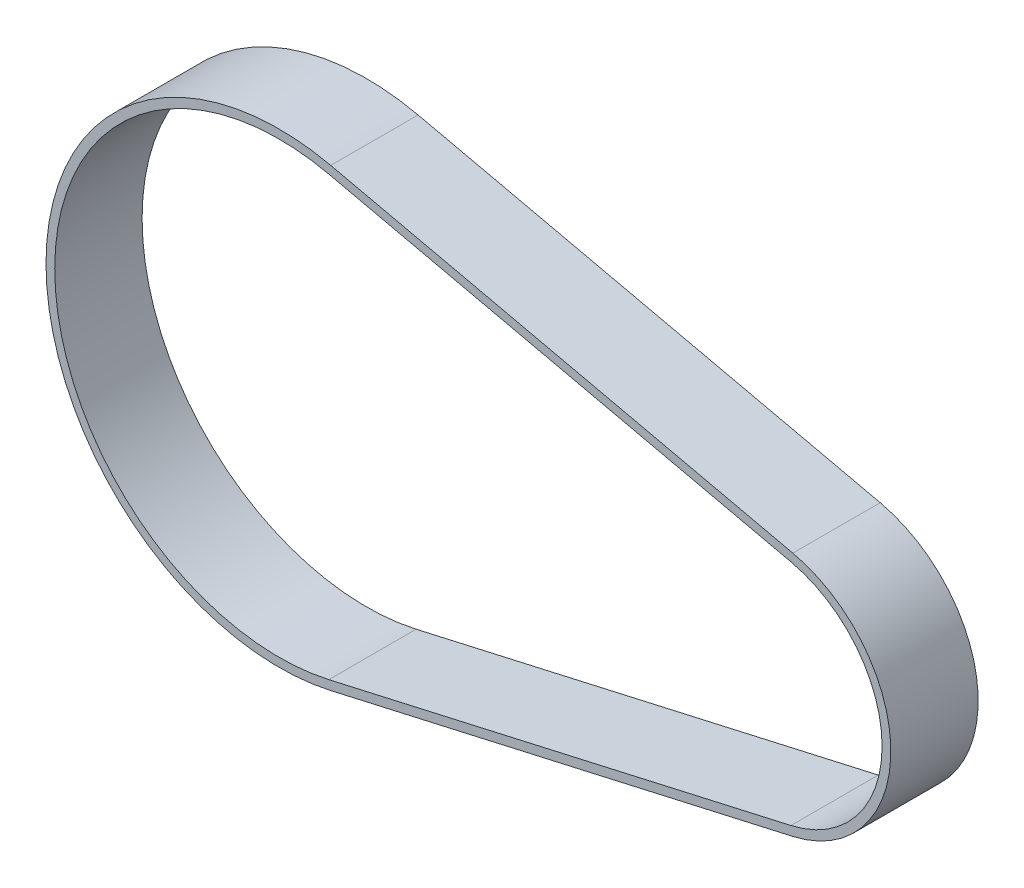
ISO-10303-21;
HEADER;
FILE_DESCRIPTION(('STEP AP214'),'2;1');
FILE_NAME('part.step','',(''),(''),'','','');
FILE_SCHEMA(('AUTOMOTIVE_DESIGN { 1 0 10303 214 1 1 1 1 }'));
ENDSEC;
DATA;
#1=APPLICATION_CONTEXT('core data for automotive mechanical design processes');
#2=APPLICATION_PROTOCOL_DEFINITION('international standard','automotive_design',2000,#1);
#3=PRODUCT_CONTEXT('',#1,'mechanical');
#4=PRODUCT('Part','Part','',(#3));
#5=PRODUCT_RELATED_PRODUCT_CATEGORY('part','',(#4));
#6=PRODUCT_DEFINITION_FORMATION('','',#4);
#7=PRODUCT_DEFINITION_CONTEXT('part definition',#1,'design');
#8=PRODUCT_DEFINITION('design','',#6,#7);
#9=PRODUCT_DEFINITION_SHAPE('','',#8);
#10=(LENGTH_UNIT() NAMED_UNIT(*) SI_UNIT(.MILLI.,.METRE.));
#11=(NAMED_UNIT(*) PLANE_ANGLE_UNIT() SI_UNIT($,.RADIAN.));
#12=(NAMED_UNIT(*) SI_UNIT($,.STERADIAN.) SOLID_ANGLE_UNIT());
#13=UNCERTAINTY_MEASURE_WITH_UNIT(LENGTH_MEASURE(1.E-05),#10,'distance_accuracy_value','');
#14=(GEOMETRIC_REPRESENTATION_CONTEXT(3) GLOBAL_UNCERTAINTY_ASSIGNED_CONTEXT((#13)) GLOBAL_UNIT_ASSIGNED_CONTEXT((#10,
#11,#12)) REPRESENTATION_CONTEXT('',''));
#15=CARTESIAN_POINT('',(0.,0.,0.));
#16=DIRECTION('',(0.,0.,1.));
#17=DIRECTION('',(1.,0.,0.));
#18=AXIS2_PLACEMENT_3D('',#15,#16,#17);
#19=CARTESIAN_POINT('',(0.,0.,10.));
#20=DIRECTION('',(0.,0.,-1.));
#21=DIRECTION('',(-1.,0.,0.));
#22=AXIS2_PLACEMENT_3D('',#19,#20,#21);
#23=PLANE('',#22);
#24=CARTESIAN_POINT('',(0.,0.,10.));
#25=DIRECTION('',(0.,0.,1.));
#26=DIRECTION('',(-1.,0.,0.));
#27=AXIS2_PLACEMENT_3D('',#24,#25,#26);
#28=CIRCLE('',#27,26.6930054672571);
#29=CARTESIAN_POINT('',(5.90067497626424,26.0326444238672,10.));
#30=VERTEX_POINT('',#29);
#31=CARTESIAN_POINT('',(5.90067497626424,-26.0326444238672,10.));
#32=VERTEX_POINT('',#31);
#33=EDGE_CURVE('E118',#30,#32,#28,.T.);
#34=ORIENTED_EDGE('',*,*,#33,.T.);
#35=DIRECTION('',(0.975260895810332,0.221056972527964,0.));
#36=VECTOR('',#35,1.);
#37=CARTESIAN_POINT('',(58.7992391930494,-14.0424205698465,10.));
#38=LINE('',#37,#36);
#39=CARTESIAN_POINT('',(58.7992391930494,-14.0424205698465,10.));
#40=VERTEX_POINT('',#39);
#41=EDGE_CURVE('E121',#32,#40,#38,.T.);
#42=ORIENTED_EDGE('',*,*,#41,.T.);
#43=CARTESIAN_POINT('',(55.6163216871081,0.,10.));
#44=DIRECTION('',(0.,0.,1.));
#45=DIRECTION('',(-1.,0.,0.));
#46=AXIS2_PLACEMENT_3D('',#43,#44,#45);
#47=CIRCLE('',#46,14.3986297719636);
#48=CARTESIAN_POINT('',(58.7992391930494,14.0424205698465,10.));
#49=VERTEX_POINT('',#48);
#50=EDGE_CURVE('E124',#40,#49,#47,.T.);
#51=ORIENTED_EDGE('',*,*,#50,.T.);
#52=DIRECTION('',(-0.975260895810332,0.221056972527964,0.));
#53=VECTOR('',#52,1.);
#54=CARTESIAN_POINT('',(5.90067497626424,26.0326444238672,10.));
#55=LINE('',#54,#53);
#56=EDGE_CURVE('E126',#49,#30,#55,.T.);
#57=ORIENTED_EDGE('',*,*,#56,.T.);
#58=EDGE_LOOP('',(#34,#42,#51,#57));
#59=FACE_BOUND('',#58,.T.);
#60=CARTESIAN_POINT('',(0.,0.,10.));
#61=DIRECTION('',(0.,0.,1.));
#62=DIRECTION('',(-1.,0.,0.));
#63=AXIS2_PLACEMENT_3D('',#60,#61,#62);
#64=CIRCLE('',#63,25.6930054672571);
#65=CARTESIAN_POINT('',(5.67961800373628,25.0573835280568,10.));
#66=VERTEX_POINT('',#65);
#67=CARTESIAN_POINT('',(5.67961800373628,-25.0573835280568,10.));
#68=VERTEX_POINT('',#67);
#69=EDGE_CURVE('E82',#66,#68,#64,.T.);
#70=ORIENTED_EDGE('',*,*,#69,.F.);
#71=DIRECTION('',(-0.975260895810332,0.221056972527964,0.));
#72=VECTOR('',#71,1.);
#73=CARTESIAN_POINT('',(5.67961800373628,25.0573835280568,10.));
#74=LINE('',#73,#72);
#75=CARTESIAN_POINT('',(58.5781822205214,13.0671596740362,10.));
#76=VERTEX_POINT('',#75);
#77=EDGE_CURVE('E104',#76,#66,#74,.T.);
#78=ORIENTED_EDGE('',*,*,#77,.F.);
#79=CARTESIAN_POINT('',(55.6163216871081,0.,10.));
#80=DIRECTION('',(0.,0.,1.));
#81=DIRECTION('',(-1.,0.,0.));
#82=AXIS2_PLACEMENT_3D('',#79,#80,#81);
#83=CIRCLE('',#82,13.3986297719636);
#84=CARTESIAN_POINT('',(58.5781822205214,-13.0671596740362,10.));
#85=VERTEX_POINT('',#84);
#86=EDGE_CURVE('E102',#85,#76,#83,.T.);
#87=ORIENTED_EDGE('',*,*,#86,.F.);
#88=DIRECTION('',(0.975260895810332,0.221056972527964,0.));
#89=VECTOR('',#88,1.);
#90=CARTESIAN_POINT('',(58.5781822205214,-13.0671596740362,10.));
#91=LINE('',#90,#89);
#92=EDGE_CURVE('E90',#68,#85,#91,.T.);
#93=ORIENTED_EDGE('',*,*,#92,.F.);
#94=EDGE_LOOP('',(#70,#78,#87,#93));
#95=FACE_BOUND('',#94,.T.);
#96=ADVANCED_FACE('F17',(#59,#95),#23,.F.);
#97=CARTESIAN_POINT('',(0.,0.,0.));
#98=DIRECTION('',(0.,0.,-1.));
#99=DIRECTION('',(-1.,0.,0.));
#100=AXIS2_PLACEMENT_3D('',#97,#98,#99);
#101=PLANE('',#100);
#102=CARTESIAN_POINT('',(0.,0.,0.));
#103=DIRECTION('',(0.,0.,1.));
#104=DIRECTION('',(-1.,0.,0.));
#105=AXIS2_PLACEMENT_3D('',#102,#103,#104);
#106=CIRCLE('',#105,26.6930054672571);
#107=CARTESIAN_POINT('',(5.90067497626424,26.0326444238672,0.));
#108=VERTEX_POINT('',#107);
#109=CARTESIAN_POINT('',(5.90067497626424,-26.0326444238672,0.));
#110=VERTEX_POINT('',#109);
#111=EDGE_CURVE('E98',#108,#110,#106,.T.);
#112=ORIENTED_EDGE('',*,*,#111,.F.);
#113=DIRECTION('',(-0.975260895810332,0.221056972527964,0.));
#114=VECTOR('',#113,1.);
#115=CARTESIAN_POINT('',(5.90067497626424,26.0326444238672,0.));
#116=LINE('',#115,#114);
#117=CARTESIAN_POINT('',(58.7992391930494,14.0424205698465,0.));
#118=VERTEX_POINT('',#117);
#119=EDGE_CURVE('E122',#118,#108,#116,.T.);
#120=ORIENTED_EDGE('',*,*,#119,.F.);
#121=CARTESIAN_POINT('',(55.6163216871081,0.,0.));
#122=DIRECTION('',(0.,0.,1.));
#123=DIRECTION('',(-1.,0.,0.));
#124=AXIS2_PLACEMENT_3D('',#121,#122,#123);
#125=CIRCLE('',#124,14.3986297719636);
#126=CARTESIAN_POINT('',(58.7992391930494,-14.0424205698465,0.));
#127=VERTEX_POINT('',#126);
#128=EDGE_CURVE('E133',#127,#118,#125,.T.);
#129=ORIENTED_EDGE('',*,*,#128,.F.);
#130=DIRECTION('',(0.975260895810332,0.221056972527964,0.));
#131=VECTOR('',#130,1.);
#132=CARTESIAN_POINT('',(58.7992391930494,-14.0424205698465,0.));
#133=LINE('',#132,#131);
#134=EDGE_CURVE('E131',#110,#127,#133,.T.);
#135=ORIENTED_EDGE('',*,*,#134,.F.);
#136=EDGE_LOOP('',(#112,#120,#129,#135));
#137=FACE_BOUND('',#136,.T.);
#138=DIRECTION('',(-0.975260895810332,0.221056972527964,0.));
#139=VECTOR('',#138,1.);
#140=CARTESIAN_POINT('',(5.67961800373628,25.0573835280568,0.));
#141=LINE('',#140,#139);
#142=CARTESIAN_POINT('',(58.5781822205214,13.0671596740362,0.));
#143=VERTEX_POINT('',#142);
#144=CARTESIAN_POINT('',(5.67961800373628,25.0573835280568,0.));
#145=VERTEX_POINT('',#144);
#146=EDGE_CURVE('E91',#143,#145,#141,.T.);
#147=ORIENTED_EDGE('',*,*,#146,.T.);
#148=CARTESIAN_POINT('',(0.,0.,0.));
#149=DIRECTION('',(0.,0.,1.));
#150=DIRECTION('',(-1.,0.,0.));
#151=AXIS2_PLACEMENT_3D('',#148,#149,#150);
#152=CIRCLE('',#151,25.6930054672571);
#153=CARTESIAN_POINT('',(5.67961800373628,-25.0573835280568,0.));
#154=VERTEX_POINT('',#153);
#155=EDGE_CURVE('E40',#145,#154,#152,.T.);
#156=ORIENTED_EDGE('',*,*,#155,.T.);
#157=DIRECTION('',(0.975260895810332,0.221056972527964,0.));
#158=VECTOR('',#157,1.);
#159=CARTESIAN_POINT('',(58.5781822205214,-13.0671596740362,0.));
#160=LINE('',#159,#158);
#161=CARTESIAN_POINT('',(58.5781822205214,-13.0671596740362,0.));
#162=VERTEX_POINT('',#161);
#163=EDGE_CURVE('E97',#154,#162,#160,.T.);
#164=ORIENTED_EDGE('',*,*,#163,.T.);
#165=CARTESIAN_POINT('',(55.6163216871081,0.,0.));
#166=DIRECTION('',(0.,0.,1.));
#167=DIRECTION('',(-1.,0.,0.));
#168=AXIS2_PLACEMENT_3D('',#165,#166,#167);
#169=CIRCLE('',#168,13.3986297719636);
#170=EDGE_CURVE('E110',#162,#143,#169,.T.);
#171=ORIENTED_EDGE('',*,*,#170,.T.);
#172=EDGE_LOOP('',(#147,#156,#164,#171));
#173=FACE_BOUND('',#172,.T.);
#174=ADVANCED_FACE('F151',(#137,#173),#101,.T.);
#175=CARTESIAN_POINT('',(0.,0.,10.));
#176=DIRECTION('',(0.,0.,-1.));
#177=DIRECTION('',(-1.,0.,0.));
#178=AXIS2_PLACEMENT_3D('',#175,#176,#177);
#179=CYLINDRICAL_SURFACE('',#178,26.6930054672571);
#180=ORIENTED_EDGE('',*,*,#111,.T.);
#181=DIRECTION('',(0.,0.,-1.));
#182=VECTOR('',#181,1.);
#183=CARTESIAN_POINT('',(5.90067497626424,-26.0326444238672,10.));
#184=LINE('',#183,#182);
#185=EDGE_CURVE('E11',#32,#110,#184,.T.);
#186=ORIENTED_EDGE('',*,*,#185,.F.);
#187=ORIENTED_EDGE('',*,*,#33,.F.);
#188=DIRECTION('',(0.,0.,-1.));
#189=VECTOR('',#188,1.);
#190=CARTESIAN_POINT('',(5.90067497626424,26.0326444238672,10.));
#191=LINE('',#190,#189);
#192=EDGE_CURVE('E128',#30,#108,#191,.T.);
#193=ORIENTED_EDGE('',*,*,#192,.T.);
#194=EDGE_LOOP('',(#180,#186,#187,#193));
#195=FACE_BOUND('',#194,.T.);
#196=ADVANCED_FACE('F19',(#195),#179,.T.);
#197=CARTESIAN_POINT('',(58.7992391930494,-14.0424205698465,10.));
#198=DIRECTION('',(-0.221056972527964,0.975260895810332,0.));
#199=DIRECTION('',(-0.975260895810332,-0.221056972527964,0.));
#200=AXIS2_PLACEMENT_3D('',#197,#198,#199);
#201=PLANE('',#200);
#202=ORIENTED_EDGE('',*,*,#134,.T.);
#203=DIRECTION('',(0.,0.,-1.));
#204=VECTOR('',#203,1.);
#205=CARTESIAN_POINT('',(58.7992391930494,-14.0424205698465,10.));
#206=LINE('',#205,#204);
#207=EDGE_CURVE('E25',#40,#127,#206,.T.);
#208=ORIENTED_EDGE('',*,*,#207,.F.);
#209=ORIENTED_EDGE('',*,*,#41,.F.);
#210=ORIENTED_EDGE('',*,*,#185,.T.);
#211=EDGE_LOOP('',(#202,#208,#209,#210));
#212=FACE_BOUND('',#211,.T.);
#213=ADVANCED_FACE('F161',(#212),#201,.F.);
#214=CARTESIAN_POINT('',(55.6163216871081,0.,10.));
#215=DIRECTION('',(0.,0.,-1.));
#216=DIRECTION('',(-1.,0.,0.));
#217=AXIS2_PLACEMENT_3D('',#214,#215,#216);
#218=CYLINDRICAL_SURFACE('',#217,14.3986297719636);
#219=ORIENTED_EDGE('',*,*,#128,.T.);
#220=DIRECTION('',(0.,0.,-1.));
#221=VECTOR('',#220,1.);
#222=CARTESIAN_POINT('',(58.7992391930494,14.0424205698465,10.));
#223=LINE('',#222,#221);
#224=EDGE_CURVE('E138',#49,#118,#223,.T.);
#225=ORIENTED_EDGE('',*,*,#224,.F.);
#226=ORIENTED_EDGE('',*,*,#50,.F.);
#227=ORIENTED_EDGE('',*,*,#207,.T.);
#228=EDGE_LOOP('',(#219,#225,#226,#227));
#229=FACE_BOUND('',#228,.T.);
#230=ADVANCED_FACE('F145',(#229),#218,.T.);
#231=CARTESIAN_POINT('',(5.90067497626424,26.0326444238672,10.));
#232=DIRECTION('',(-0.221056972527964,-0.975260895810332,0.));
#233=DIRECTION('',(0.975260895810332,-0.221056972527964,0.));
#234=AXIS2_PLACEMENT_3D('',#231,#232,#233);
#235=PLANE('',#234);
#236=ORIENTED_EDGE('',*,*,#119,.T.);
#237=ORIENTED_EDGE('',*,*,#192,.F.);
#238=ORIENTED_EDGE('',*,*,#56,.F.);
#239=ORIENTED_EDGE('',*,*,#224,.T.);
#240=EDGE_LOOP('',(#236,#237,#238,#239));
#241=FACE_BOUND('',#240,.T.);
#242=ADVANCED_FACE('F155',(#241),#235,.F.);
#243=CARTESIAN_POINT('',(0.,0.,10.));
#244=DIRECTION('',(0.,0.,-1.));
#245=DIRECTION('',(-1.,0.,0.));
#246=AXIS2_PLACEMENT_3D('',#243,#244,#245);
#247=CYLINDRICAL_SURFACE('',#246,25.6930054672571);
#248=ORIENTED_EDGE('',*,*,#155,.F.);
#249=DIRECTION('',(0.,0.,-1.));
#250=VECTOR('',#249,1.);
#251=CARTESIAN_POINT('',(5.67961800373628,25.0573835280568,10.));
#252=LINE('',#251,#250);
#253=EDGE_CURVE('E86',#66,#145,#252,.T.);
#254=ORIENTED_EDGE('',*,*,#253,.F.);
#255=ORIENTED_EDGE('',*,*,#69,.T.);
#256=DIRECTION('',(0.,0.,-1.));
#257=VECTOR('',#256,1.);
#258=CARTESIAN_POINT('',(5.67961800373628,-25.0573835280568,10.));
#259=LINE('',#258,#257);
#260=EDGE_CURVE('E85',#68,#154,#259,.T.);
#261=ORIENTED_EDGE('',*,*,#260,.T.);
#262=EDGE_LOOP('',(#248,#254,#255,#261));
#263=FACE_BOUND('',#262,.T.);
#264=ADVANCED_FACE('F84',(#263),#247,.F.);
#265=CARTESIAN_POINT('',(58.5781822205214,-13.0671596740362,10.));
#266=DIRECTION('',(-0.221056972527964,0.975260895810332,0.));
#267=DIRECTION('',(-0.975260895810332,-0.221056972527964,0.));
#268=AXIS2_PLACEMENT_3D('',#265,#266,#267);
#269=PLANE('',#268);
#270=ORIENTED_EDGE('',*,*,#163,.F.);
#271=ORIENTED_EDGE('',*,*,#260,.F.);
#272=ORIENTED_EDGE('',*,*,#92,.T.);
#273=DIRECTION('',(0.,0.,-1.));
#274=VECTOR('',#273,1.);
#275=CARTESIAN_POINT('',(58.5781822205214,-13.0671596740362,10.));
#276=LINE('',#275,#274);
#277=EDGE_CURVE('E99',#85,#162,#276,.T.);
#278=ORIENTED_EDGE('',*,*,#277,.T.);
#279=EDGE_LOOP('',(#270,#271,#272,#278));
#280=FACE_BOUND('',#279,.T.);
#281=ADVANCED_FACE('F94',(#280),#269,.T.);
#282=CARTESIAN_POINT('',(55.6163216871081,0.,10.));
#283=DIRECTION('',(0.,0.,-1.));
#284=DIRECTION('',(-1.,0.,0.));
#285=AXIS2_PLACEMENT_3D('',#282,#283,#284);
#286=CYLINDRICAL_SURFACE('',#285,13.3986297719636);
#287=ORIENTED_EDGE('',*,*,#170,.F.);
#288=ORIENTED_EDGE('',*,*,#277,.F.);
#289=ORIENTED_EDGE('',*,*,#86,.T.);
#290=DIRECTION('',(0.,0.,-1.));
#291=VECTOR('',#290,1.);
#292=CARTESIAN_POINT('',(58.5781822205214,13.0671596740362,10.));
#293=LINE('',#292,#291);
#294=EDGE_CURVE('E32',#76,#143,#293,.T.);
#295=ORIENTED_EDGE('',*,*,#294,.T.);
#296=EDGE_LOOP('',(#287,#288,#289,#295));
#297=FACE_BOUND('',#296,.T.);
#298=ADVANCED_FACE('F189',(#297),#286,.F.);
#299=CARTESIAN_POINT('',(5.67961800373628,25.0573835280568,10.));
#300=DIRECTION('',(-0.221056972527964,-0.975260895810332,0.));
#301=DIRECTION('',(0.975260895810332,-0.221056972527964,0.));
#302=AXIS2_PLACEMENT_3D('',#299,#300,#301);
#303=PLANE('',#302);
#304=ORIENTED_EDGE('',*,*,#146,.F.);
#305=ORIENTED_EDGE('',*,*,#294,.F.);
#306=ORIENTED_EDGE('',*,*,#77,.T.);
#307=ORIENTED_EDGE('',*,*,#253,.T.);
#308=EDGE_LOOP('',(#304,#305,#306,#307));
#309=FACE_BOUND('',#308,.T.);
#310=ADVANCED_FACE('F194',(#309),#303,.T.);
#311=CLOSED_SHELL('',(#96,#174,#196,#213,#230,#242,#264,#281,#298,#310));
#312=MANIFOLD_SOLID_BREP('B1',#311);
#313=ADVANCED_BREP_SHAPE_REPRESENTATION('',(#18,#312),#14);
#314=SHAPE_DEFINITION_REPRESENTATION(#9,#313);
ENDSEC;
END-ISO-10303-21;
